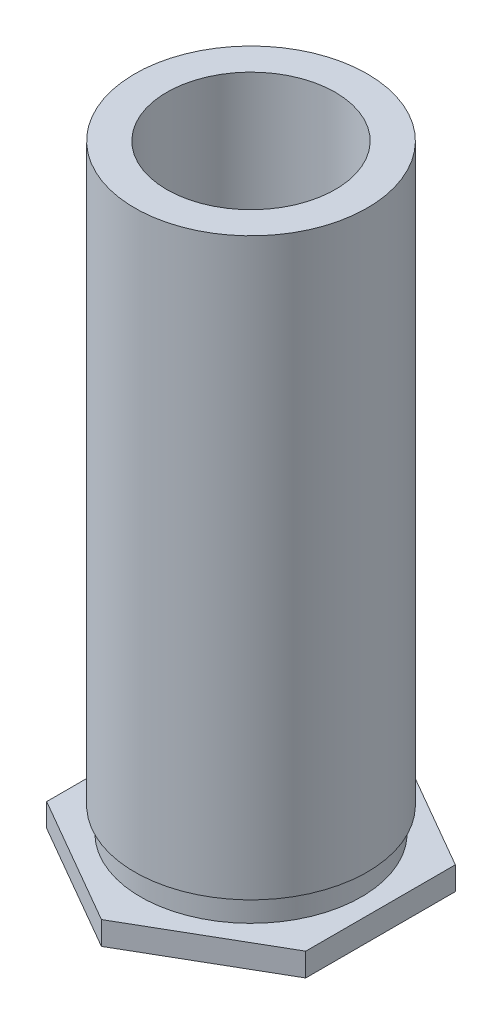
ISO-10303-21;
HEADER;
FILE_DESCRIPTION(('STEP AP214'),'2;1');
FILE_NAME('part.step','',(''),(''),'','','');
FILE_SCHEMA(('AUTOMOTIVE_DESIGN { 1 0 10303 214 1 1 1 1 }'));
ENDSEC;
DATA;
#1=APPLICATION_CONTEXT('core data for automotive mechanical design processes');
#2=APPLICATION_PROTOCOL_DEFINITION('international standard','automotive_design',2000,#1);
#3=PRODUCT_CONTEXT('',#1,'mechanical');
#4=PRODUCT('Part','Part','',(#3));
#5=PRODUCT_RELATED_PRODUCT_CATEGORY('part','',(#4));
#6=PRODUCT_DEFINITION_FORMATION('','',#4);
#7=PRODUCT_DEFINITION_CONTEXT('part definition',#1,'design');
#8=PRODUCT_DEFINITION('design','',#6,#7);
#9=PRODUCT_DEFINITION_SHAPE('','',#8);
#10=(LENGTH_UNIT() NAMED_UNIT(*) SI_UNIT(.MILLI.,.METRE.));
#11=(NAMED_UNIT(*) PLANE_ANGLE_UNIT() SI_UNIT($,.RADIAN.));
#12=(NAMED_UNIT(*) SI_UNIT($,.STERADIAN.) SOLID_ANGLE_UNIT());
#13=UNCERTAINTY_MEASURE_WITH_UNIT(LENGTH_MEASURE(1.E-05),#10,'distance_accuracy_value','');
#14=(GEOMETRIC_REPRESENTATION_CONTEXT(3) GLOBAL_UNCERTAINTY_ASSIGNED_CONTEXT((#13)) GLOBAL_UNIT_ASSIGNED_CONTEXT((#10,
#11,#12)) REPRESENTATION_CONTEXT('',''));
#15=CARTESIAN_POINT('',(0.,0.,0.));
#16=DIRECTION('',(0.,0.,1.));
#17=DIRECTION('',(1.,0.,0.));
#18=AXIS2_PLACEMENT_3D('',#15,#16,#17);
#19=CARTESIAN_POINT('',(4.596384,0.7112,0.));
#20=DIRECTION('',(0.,1.,0.));
#21=DIRECTION('',(0.,0.,1.));
#22=AXIS2_PLACEMENT_3D('',#19,#20,#21);
#23=PLANE('',#22);
#24=CARTESIAN_POINT('',(0.,0.711199999999999,0.));
#25=DIRECTION('',(0.,-1.,0.));
#26=DIRECTION('',(0.,0.,-1.));
#27=AXIS2_PLACEMENT_3D('',#24,#25,#26);
#28=CIRCLE('',#27,3.3782);
#29=CARTESIAN_POINT('',(0.,0.711199999999999,-3.3782));
#30=VERTEX_POINT('',#29);
#31=EDGE_CURVE('E11',#30,#30,#28,.T.);
#32=ORIENTED_EDGE('',*,*,#31,.T.);
#33=EDGE_LOOP('',(#32));
#34=FACE_BOUND('',#33,.T.);
#35=DIRECTION('',(0.866025403784439,0.,0.5));
#36=VECTOR('',#35,1.);
#37=CARTESIAN_POINT('',(0.,0.7112,4.57538541327395));
#38=LINE('',#37,#36);
#39=CARTESIAN_POINT('',(-3.9624,0.7112,2.28769270663697));
#40=VERTEX_POINT('',#39);
#41=CARTESIAN_POINT('',(0.,0.7112,4.57538541327395));
#42=VERTEX_POINT('',#41);
#43=EDGE_CURVE('E128',#40,#42,#38,.T.);
#44=ORIENTED_EDGE('',*,*,#43,.T.);
#45=DIRECTION('',(0.866025403784439,0.,-0.5));
#46=VECTOR('',#45,1.);
#47=CARTESIAN_POINT('',(3.9624,0.7112,2.28769270663697));
#48=LINE('',#47,#46);
#49=CARTESIAN_POINT('',(3.9624,0.7112,2.28769270663697));
#50=VERTEX_POINT('',#49);
#51=EDGE_CURVE('E117',#42,#50,#48,.T.);
#52=ORIENTED_EDGE('',*,*,#51,.T.);
#53=DIRECTION('',(0.,0.,-1.));
#54=VECTOR('',#53,1.);
#55=CARTESIAN_POINT('',(3.9624,0.7112,-2.28769270663697));
#56=LINE('',#55,#54);
#57=CARTESIAN_POINT('',(3.9624,0.7112,-2.28769270663697));
#58=VERTEX_POINT('',#57);
#59=EDGE_CURVE('E120',#50,#58,#56,.T.);
#60=ORIENTED_EDGE('',*,*,#59,.T.);
#61=DIRECTION('',(-0.866025403784439,0.,-0.5));
#62=VECTOR('',#61,1.);
#63=CARTESIAN_POINT('',(0.,0.7112,-4.57538541327395));
#64=LINE('',#63,#62);
#65=CARTESIAN_POINT('',(0.,0.7112,-4.57538541327395));
#66=VERTEX_POINT('',#65);
#67=EDGE_CURVE('E48',#58,#66,#64,.T.);
#68=ORIENTED_EDGE('',*,*,#67,.T.);
#69=DIRECTION('',(-0.866025403784439,0.,0.5));
#70=VECTOR('',#69,1.);
#71=CARTESIAN_POINT('',(-3.9624,0.7112,-2.28769270663697));
#72=LINE('',#71,#70);
#73=CARTESIAN_POINT('',(-3.9624,0.7112,-2.28769270663697));
#74=VERTEX_POINT('',#73);
#75=EDGE_CURVE('E93',#66,#74,#72,.T.);
#76=ORIENTED_EDGE('',*,*,#75,.T.);
#77=DIRECTION('',(0.,0.,1.));
#78=VECTOR('',#77,1.);
#79=CARTESIAN_POINT('',(-3.9624,0.7112,2.28769270663697));
#80=LINE('',#79,#78);
#81=EDGE_CURVE('E125',#74,#40,#80,.T.);
#82=ORIENTED_EDGE('',*,*,#81,.T.);
#83=EDGE_LOOP('',(#44,#52,#60,#68,#76,#82));
#84=FACE_BOUND('',#83,.T.);
#85=ADVANCED_FACE('F32',(#34,#84),#23,.T.);
#86=CARTESIAN_POINT('',(3.556,0.,0.));
#87=DIRECTION('',(0.,-1.,0.));
#88=DIRECTION('',(0.,0.,-1.));
#89=AXIS2_PLACEMENT_3D('',#86,#87,#88);
#90=PLANE('',#89);
#91=CARTESIAN_POINT('',(0.,0.,0.));
#92=DIRECTION('',(0.,-1.,0.));
#93=DIRECTION('',(0.,0.,-1.));
#94=AXIS2_PLACEMENT_3D('',#91,#92,#93);
#95=CIRCLE('',#94,3.556);
#96=CARTESIAN_POINT('',(0.,0.,-3.556));
#97=VERTEX_POINT('',#96);
#98=EDGE_CURVE('E147',#97,#97,#95,.T.);
#99=ORIENTED_EDGE('',*,*,#98,.F.);
#100=EDGE_LOOP('',(#99));
#101=FACE_BOUND('',#100,.T.);
#102=DIRECTION('',(0.,0.,-1.));
#103=VECTOR('',#102,1.);
#104=CARTESIAN_POINT('',(3.9624,0.,-2.28769270663697));
#105=LINE('',#104,#103);
#106=CARTESIAN_POINT('',(3.9624,0.,2.28769270663697));
#107=VERTEX_POINT('',#106);
#108=CARTESIAN_POINT('',(3.9624,0.,-2.28769270663697));
#109=VERTEX_POINT('',#108);
#110=EDGE_CURVE('E103',#107,#109,#105,.T.);
#111=ORIENTED_EDGE('',*,*,#110,.F.);
#112=DIRECTION('',(0.866025403784439,0.,-0.5));
#113=VECTOR('',#112,1.);
#114=CARTESIAN_POINT('',(3.9624,0.,2.28769270663697));
#115=LINE('',#114,#113);
#116=CARTESIAN_POINT('',(0.,0.,4.57538541327395));
#117=VERTEX_POINT('',#116);
#118=EDGE_CURVE('E56',#117,#107,#115,.T.);
#119=ORIENTED_EDGE('',*,*,#118,.F.);
#120=DIRECTION('',(0.866025403784439,0.,0.5));
#121=VECTOR('',#120,1.);
#122=CARTESIAN_POINT('',(0.,0.,4.57538541327395));
#123=LINE('',#122,#121);
#124=CARTESIAN_POINT('',(-3.9624,0.,2.28769270663697));
#125=VERTEX_POINT('',#124);
#126=EDGE_CURVE('E110',#125,#117,#123,.T.);
#127=ORIENTED_EDGE('',*,*,#126,.F.);
#128=DIRECTION('',(0.,0.,1.));
#129=VECTOR('',#128,1.);
#130=CARTESIAN_POINT('',(-3.9624,0.,2.28769270663697));
#131=LINE('',#130,#129);
#132=CARTESIAN_POINT('',(-3.9624,0.,-2.28769270663697));
#133=VERTEX_POINT('',#132);
#134=EDGE_CURVE('E108',#133,#125,#131,.T.);
#135=ORIENTED_EDGE('',*,*,#134,.F.);
#136=DIRECTION('',(-0.866025403784439,0.,0.5));
#137=VECTOR('',#136,1.);
#138=CARTESIAN_POINT('',(-3.9624,0.,-2.28769270663697));
#139=LINE('',#138,#137);
#140=CARTESIAN_POINT('',(0.,0.,-4.57538541327395));
#141=VERTEX_POINT('',#140);
#142=EDGE_CURVE('E90',#141,#133,#139,.T.);
#143=ORIENTED_EDGE('',*,*,#142,.F.);
#144=DIRECTION('',(-0.866025403784439,0.,-0.5));
#145=VECTOR('',#144,1.);
#146=CARTESIAN_POINT('',(0.,0.,-4.57538541327395));
#147=LINE('',#146,#145);
#148=EDGE_CURVE('E98',#109,#141,#147,.T.);
#149=ORIENTED_EDGE('',*,*,#148,.F.);
#150=EDGE_LOOP('',(#111,#119,#127,#135,#143,#149));
#151=FACE_BOUND('',#150,.T.);
#152=ADVANCED_FACE('F105',(#101,#151),#90,.T.);
#153=CARTESIAN_POINT('',(0.,0.,0.));
#154=DIRECTION('',(0.,-1.,0.));
#155=DIRECTION('',(0.,0.,-1.));
#156=AXIS2_PLACEMENT_3D('',#153,#154,#155);
#157=CYLINDRICAL_SURFACE('',#156,3.3782);
#158=CARTESIAN_POINT('',(0.,1.45796,0.));
#159=DIRECTION('',(0.,-1.,0.));
#160=DIRECTION('',(0.,0.,-1.));
#161=AXIS2_PLACEMENT_3D('',#158,#159,#160);
#162=CIRCLE('',#161,3.3782);
#163=CARTESIAN_POINT('',(0.,1.45796,-3.3782));
#164=VERTEX_POINT('',#163);
#165=EDGE_CURVE('E40',#164,#164,#162,.T.);
#166=ORIENTED_EDGE('',*,*,#165,.T.);
#167=EDGE_LOOP('',(#166));
#168=FACE_BOUND('',#167,.T.);
#169=ORIENTED_EDGE('',*,*,#31,.F.);
#170=EDGE_LOOP('',(#169));
#171=FACE_BOUND('',#170,.T.);
#172=ADVANCED_FACE('F186',(#168,#171),#157,.T.);
#173=CARTESIAN_POINT('',(3.556,1.45796,0.));
#174=DIRECTION('',(0.,-1.,0.));
#175=DIRECTION('',(0.,0.,-1.));
#176=AXIS2_PLACEMENT_3D('',#173,#174,#175);
#177=PLANE('',#176);
#178=CARTESIAN_POINT('',(0.,1.45796,0.));
#179=DIRECTION('',(0.,-1.,0.));
#180=DIRECTION('',(0.,0.,-1.));
#181=AXIS2_PLACEMENT_3D('',#178,#179,#180);
#182=CIRCLE('',#181,3.556);
#183=CARTESIAN_POINT('',(0.,1.45796,-3.556));
#184=VERTEX_POINT('',#183);
#185=EDGE_CURVE('E157',#184,#184,#182,.T.);
#186=ORIENTED_EDGE('',*,*,#185,.T.);
#187=EDGE_LOOP('',(#186));
#188=FACE_BOUND('',#187,.T.);
#189=ORIENTED_EDGE('',*,*,#165,.F.);
#190=EDGE_LOOP('',(#189));
#191=FACE_BOUND('',#190,.T.);
#192=ADVANCED_FACE('F180',(#188,#191),#177,.T.);
#193=CARTESIAN_POINT('',(0.,0.,0.));
#194=DIRECTION('',(0.,-1.,0.));
#195=DIRECTION('',(0.,0.,-1.));
#196=AXIS2_PLACEMENT_3D('',#193,#194,#195);
#197=CYLINDRICAL_SURFACE('',#196,3.556);
#198=CARTESIAN_POINT('',(0.,19.05,0.));
#199=DIRECTION('',(0.,-1.,0.));
#200=DIRECTION('',(0.,0.,-1.));
#201=AXIS2_PLACEMENT_3D('',#198,#199,#200);
#202=CIRCLE('',#201,3.556);
#203=CARTESIAN_POINT('',(0.,19.05,-3.556));
#204=VERTEX_POINT('',#203);
#205=EDGE_CURVE('E154',#204,#204,#202,.T.);
#206=ORIENTED_EDGE('',*,*,#205,.T.);
#207=EDGE_LOOP('',(#206));
#208=FACE_BOUND('',#207,.T.);
#209=ORIENTED_EDGE('',*,*,#185,.F.);
#210=EDGE_LOOP('',(#209));
#211=FACE_BOUND('',#210,.T.);
#212=ADVANCED_FACE('F174',(#208,#211),#197,.T.);
#213=CARTESIAN_POINT('',(3.556,19.05,0.));
#214=DIRECTION('',(0.,1.,0.));
#215=DIRECTION('',(0.,0.,1.));
#216=AXIS2_PLACEMENT_3D('',#213,#214,#215);
#217=PLANE('',#216);
#218=CARTESIAN_POINT('',(0.,19.05,0.));
#219=DIRECTION('',(0.,1.,0.));
#220=DIRECTION('',(0.,0.,1.));
#221=AXIS2_PLACEMENT_3D('',#218,#219,#220);
#222=CIRCLE('',#221,2.5781);
#223=CARTESIAN_POINT('',(0.,19.05,2.5781));
#224=VERTEX_POINT('',#223);
#225=EDGE_CURVE('E35',#224,#224,#222,.T.);
#226=ORIENTED_EDGE('',*,*,#225,.F.);
#227=EDGE_LOOP('',(#226));
#228=FACE_BOUND('',#227,.T.);
#229=ORIENTED_EDGE('',*,*,#205,.F.);
#230=EDGE_LOOP('',(#229));
#231=FACE_BOUND('',#230,.T.);
#232=ADVANCED_FACE('F170',(#228,#231),#217,.T.);
#233=CARTESIAN_POINT('',(0.,0.,0.));
#234=DIRECTION('',(0.,-1.,0.));
#235=DIRECTION('',(0.,0.,-1.));
#236=AXIS2_PLACEMENT_3D('',#233,#234,#235);
#237=CYLINDRICAL_SURFACE('',#236,1.94056);
#238=CARTESIAN_POINT('',(0.,10.7945168195347,0.));
#239=DIRECTION('',(0.,-1.,0.));
#240=DIRECTION('',(0.,0.,-1.));
#241=AXIS2_PLACEMENT_3D('',#238,#239,#240);
#242=CIRCLE('',#241,1.94056);
#243=CARTESIAN_POINT('',(0.,10.7945168195347,-1.94056));
#244=VERTEX_POINT('',#243);
#245=EDGE_CURVE('E141',#244,#244,#242,.T.);
#246=ORIENTED_EDGE('',*,*,#245,.F.);
#247=EDGE_LOOP('',(#246));
#248=FACE_BOUND('',#247,.T.);
#249=CARTESIAN_POINT('',(0.,0.00253999999999977,0.));
#250=DIRECTION('',(0.,-1.,0.));
#251=DIRECTION('',(0.,0.,-1.));
#252=AXIS2_PLACEMENT_3D('',#249,#250,#251);
#253=CIRCLE('',#252,1.94056);
#254=CARTESIAN_POINT('',(0.,0.00253999999999977,-1.94056));
#255=VERTEX_POINT('',#254);
#256=EDGE_CURVE('E151',#255,#255,#253,.T.);
#257=ORIENTED_EDGE('',*,*,#256,.T.);
#258=EDGE_LOOP('',(#257));
#259=FACE_BOUND('',#258,.T.);
#260=ADVANCED_FACE('F173',(#248,#259),#237,.F.);
#261=CARTESIAN_POINT('',(3.556,0.00253999999999977,0.));
#262=DIRECTION('',(0.,-1.,0.));
#263=DIRECTION('',(0.,0.,-1.));
#264=AXIS2_PLACEMENT_3D('',#261,#262,#263);
#265=PLANE('',#264);
#266=ORIENTED_EDGE('',*,*,#256,.F.);
#267=EDGE_LOOP('',(#266));
#268=FACE_BOUND('',#267,.T.);
#269=CARTESIAN_POINT('',(0.,0.00253999999999999,0.));
#270=DIRECTION('',(0.,-1.,0.));
#271=DIRECTION('',(0.,0.,-1.));
#272=AXIS2_PLACEMENT_3D('',#269,#270,#271);
#273=CIRCLE('',#272,3.556);
#274=CARTESIAN_POINT('',(0.,0.00253999999999999,-3.556));
#275=VERTEX_POINT('',#274);
#276=EDGE_CURVE('E150',#275,#275,#273,.T.);
#277=ORIENTED_EDGE('',*,*,#276,.T.);
#278=EDGE_LOOP('',(#277));
#279=FACE_BOUND('',#278,.T.);
#280=ADVANCED_FACE('F232',(#268,#279),#265,.T.);
#281=CARTESIAN_POINT('',(0.,0.,0.));
#282=DIRECTION('',(0.,-1.,0.));
#283=DIRECTION('',(0.,0.,-1.));
#284=AXIS2_PLACEMENT_3D('',#281,#282,#283);
#285=CYLINDRICAL_SURFACE('',#284,3.556);
#286=ORIENTED_EDGE('',*,*,#98,.T.);
#287=EDGE_LOOP('',(#286));
#288=FACE_BOUND('',#287,.T.);
#289=ORIENTED_EDGE('',*,*,#276,.F.);
#290=EDGE_LOOP('',(#289));
#291=FACE_BOUND('',#290,.T.);
#292=ADVANCED_FACE('F225',(#288,#291),#285,.F.);
#293=CARTESIAN_POINT('',(2.5781,11.1252,0.));
#294=DIRECTION('',(0.,-1.,0.));
#295=DIRECTION('',(0.,0.,-1.));
#296=AXIS2_PLACEMENT_3D('',#293,#294,#295);
#297=PLANE('',#296);
#298=CARTESIAN_POINT('',(0.,11.1252,0.));
#299=DIRECTION('',(0.,-1.,0.));
#300=DIRECTION('',(0.,0.,-1.));
#301=AXIS2_PLACEMENT_3D('',#298,#299,#300);
#302=CIRCLE('',#301,2.5781);
#303=CARTESIAN_POINT('',(0.,11.1252,-2.5781));
#304=VERTEX_POINT('',#303);
#305=EDGE_CURVE('E133',#304,#304,#302,.T.);
#306=ORIENTED_EDGE('',*,*,#305,.F.);
#307=EDGE_LOOP('',(#306));
#308=FACE_BOUND('',#307,.T.);
#309=CARTESIAN_POINT('',(0.,11.1252,0.));
#310=DIRECTION('',(0.,-1.,0.));
#311=DIRECTION('',(0.,0.,-1.));
#312=AXIS2_PLACEMENT_3D('',#309,#310,#311);
#313=CIRCLE('',#312,2.413);
#314=CARTESIAN_POINT('',(0.,11.1252,-2.413));
#315=VERTEX_POINT('',#314);
#316=EDGE_CURVE('E144',#315,#315,#313,.T.);
#317=ORIENTED_EDGE('',*,*,#316,.T.);
#318=EDGE_LOOP('',(#317));
#319=FACE_BOUND('',#318,.T.);
#320=ADVANCED_FACE('F221',(#308,#319),#297,.F.);
#321=CARTESIAN_POINT('',(0.,10.7945168195347,0.));
#322=DIRECTION('',(0.,1.,0.));
#323=DIRECTION('',(0.,0.,1.));
#324=AXIS2_PLACEMENT_3D('',#321,#322,#323);
#325=CONICAL_SURFACE('',#324,1.94056,0.960105621522079);
#326=ORIENTED_EDGE('',*,*,#316,.F.);
#327=EDGE_LOOP('',(#326));
#328=FACE_BOUND('',#327,.T.);
#329=ORIENTED_EDGE('',*,*,#245,.T.);
#330=EDGE_LOOP('',(#329));
#331=FACE_BOUND('',#330,.T.);
#332=ADVANCED_FACE('F218',(#328,#331),#325,.F.);
#333=CARTESIAN_POINT('',(0.,-2.54,0.));
#334=DIRECTION('',(0.,-1.,0.));
#335=DIRECTION('',(0.,0.,-1.));
#336=AXIS2_PLACEMENT_3D('',#333,#334,#335);
#337=CYLINDRICAL_SURFACE('',#336,2.5781);
#338=ORIENTED_EDGE('',*,*,#225,.T.);
#339=EDGE_LOOP('',(#338));
#340=FACE_BOUND('',#339,.T.);
#341=ORIENTED_EDGE('',*,*,#305,.T.);
#342=EDGE_LOOP('',(#341));
#343=FACE_BOUND('',#342,.T.);
#344=ADVANCED_FACE('F167',(#340,#343),#337,.F.);
#345=CARTESIAN_POINT('',(3.9624,0.,2.28769270663697));
#346=DIRECTION('',(0.5,0.,0.866025403784439));
#347=DIRECTION('',(0.866025403784439,0.,-0.5));
#348=AXIS2_PLACEMENT_3D('',#345,#346,#347);
#349=PLANE('',#348);
#350=ORIENTED_EDGE('',*,*,#51,.F.);
#351=DIRECTION('',(0.,1.,0.));
#352=VECTOR('',#351,1.);
#353=CARTESIAN_POINT('',(0.,0.,4.57538541327395));
#354=LINE('',#353,#352);
#355=EDGE_CURVE('E131',#117,#42,#354,.T.);
#356=ORIENTED_EDGE('',*,*,#355,.F.);
#357=ORIENTED_EDGE('',*,*,#118,.T.);
#358=DIRECTION('',(0.,1.,0.));
#359=VECTOR('',#358,1.);
#360=CARTESIAN_POINT('',(3.9624,0.,2.28769270663697));
#361=LINE('',#360,#359);
#362=EDGE_CURVE('E116',#107,#50,#361,.T.);
#363=ORIENTED_EDGE('',*,*,#362,.T.);
#364=EDGE_LOOP('',(#350,#356,#357,#363));
#365=FACE_BOUND('',#364,.T.);
#366=ADVANCED_FACE('F201',(#365),#349,.T.);
#367=CARTESIAN_POINT('',(0.,0.,4.57538541327395));
#368=DIRECTION('',(-0.5,0.,0.866025403784439));
#369=DIRECTION('',(0.866025403784439,0.,0.5));
#370=AXIS2_PLACEMENT_3D('',#367,#368,#369);
#371=PLANE('',#370);
#372=ORIENTED_EDGE('',*,*,#43,.F.);
#373=DIRECTION('',(0.,1.,0.));
#374=VECTOR('',#373,1.);
#375=CARTESIAN_POINT('',(-3.9624,0.,2.28769270663697));
#376=LINE('',#375,#374);
#377=EDGE_CURVE('E134',#125,#40,#376,.T.);
#378=ORIENTED_EDGE('',*,*,#377,.F.);
#379=ORIENTED_EDGE('',*,*,#126,.T.);
#380=ORIENTED_EDGE('',*,*,#355,.T.);
#381=EDGE_LOOP('',(#372,#378,#379,#380));
#382=FACE_BOUND('',#381,.T.);
#383=ADVANCED_FACE('F200',(#382),#371,.T.);
#384=CARTESIAN_POINT('',(-3.9624,0.,2.28769270663697));
#385=DIRECTION('',(-1.,0.,0.));
#386=DIRECTION('',(0.,0.,1.));
#387=AXIS2_PLACEMENT_3D('',#384,#385,#386);
#388=PLANE('',#387);
#389=ORIENTED_EDGE('',*,*,#81,.F.);
#390=DIRECTION('',(0.,1.,0.));
#391=VECTOR('',#390,1.);
#392=CARTESIAN_POINT('',(-3.9624,0.,-2.28769270663697));
#393=LINE('',#392,#391);
#394=EDGE_CURVE('E94',#133,#74,#393,.T.);
#395=ORIENTED_EDGE('',*,*,#394,.F.);
#396=ORIENTED_EDGE('',*,*,#134,.T.);
#397=ORIENTED_EDGE('',*,*,#377,.T.);
#398=EDGE_LOOP('',(#389,#395,#396,#397));
#399=FACE_BOUND('',#398,.T.);
#400=ADVANCED_FACE('F278',(#399),#388,.T.);
#401=CARTESIAN_POINT('',(-3.9624,0.,-2.28769270663697));
#402=DIRECTION('',(-0.5,0.,-0.866025403784439));
#403=DIRECTION('',(-0.866025403784439,0.,0.5));
#404=AXIS2_PLACEMENT_3D('',#401,#402,#403);
#405=PLANE('',#404);
#406=ORIENTED_EDGE('',*,*,#75,.F.);
#407=DIRECTION('',(0.,1.,0.));
#408=VECTOR('',#407,1.);
#409=CARTESIAN_POINT('',(0.,0.,-4.57538541327395));
#410=LINE('',#409,#408);
#411=EDGE_CURVE('E86',#141,#66,#410,.T.);
#412=ORIENTED_EDGE('',*,*,#411,.F.);
#413=ORIENTED_EDGE('',*,*,#142,.T.);
#414=ORIENTED_EDGE('',*,*,#394,.T.);
#415=EDGE_LOOP('',(#406,#412,#413,#414));
#416=FACE_BOUND('',#415,.T.);
#417=ADVANCED_FACE('F88',(#416),#405,.T.);
#418=CARTESIAN_POINT('',(0.,0.,-4.57538541327395));
#419=DIRECTION('',(0.5,0.,-0.866025403784439));
#420=DIRECTION('',(-0.866025403784439,0.,-0.5));
#421=AXIS2_PLACEMENT_3D('',#418,#419,#420);
#422=PLANE('',#421);
#423=ORIENTED_EDGE('',*,*,#67,.F.);
#424=DIRECTION('',(0.,1.,0.));
#425=VECTOR('',#424,1.);
#426=CARTESIAN_POINT('',(3.9624,0.,-2.28769270663697));
#427=LINE('',#426,#425);
#428=EDGE_CURVE('E95',#109,#58,#427,.T.);
#429=ORIENTED_EDGE('',*,*,#428,.F.);
#430=ORIENTED_EDGE('',*,*,#148,.T.);
#431=ORIENTED_EDGE('',*,*,#411,.T.);
#432=EDGE_LOOP('',(#423,#429,#430,#431));
#433=FACE_BOUND('',#432,.T.);
#434=ADVANCED_FACE('F99',(#433),#422,.T.);
#435=CARTESIAN_POINT('',(3.9624,0.,-2.28769270663697));
#436=DIRECTION('',(1.,0.,0.));
#437=DIRECTION('',(0.,0.,-1.));
#438=AXIS2_PLACEMENT_3D('',#435,#436,#437);
#439=PLANE('',#438);
#440=ORIENTED_EDGE('',*,*,#59,.F.);
#441=ORIENTED_EDGE('',*,*,#362,.F.);
#442=ORIENTED_EDGE('',*,*,#110,.T.);
#443=ORIENTED_EDGE('',*,*,#428,.T.);
#444=EDGE_LOOP('',(#440,#441,#442,#443));
#445=FACE_BOUND('',#444,.T.);
#446=ADVANCED_FACE('F204',(#445),#439,.T.);
#447=CLOSED_SHELL('',(#85,#152,#172,#192,#212,#232,#260,#280,#292,#320,#332,#344,#366,#383,#400,
#417,#434,#446));
#448=MANIFOLD_SOLID_BREP('B2',#447);
#449=ADVANCED_BREP_SHAPE_REPRESENTATION('',(#18,#448),#14);
#450=SHAPE_DEFINITION_REPRESENTATION(#9,#449);
ENDSEC;
END-ISO-10303-21;
